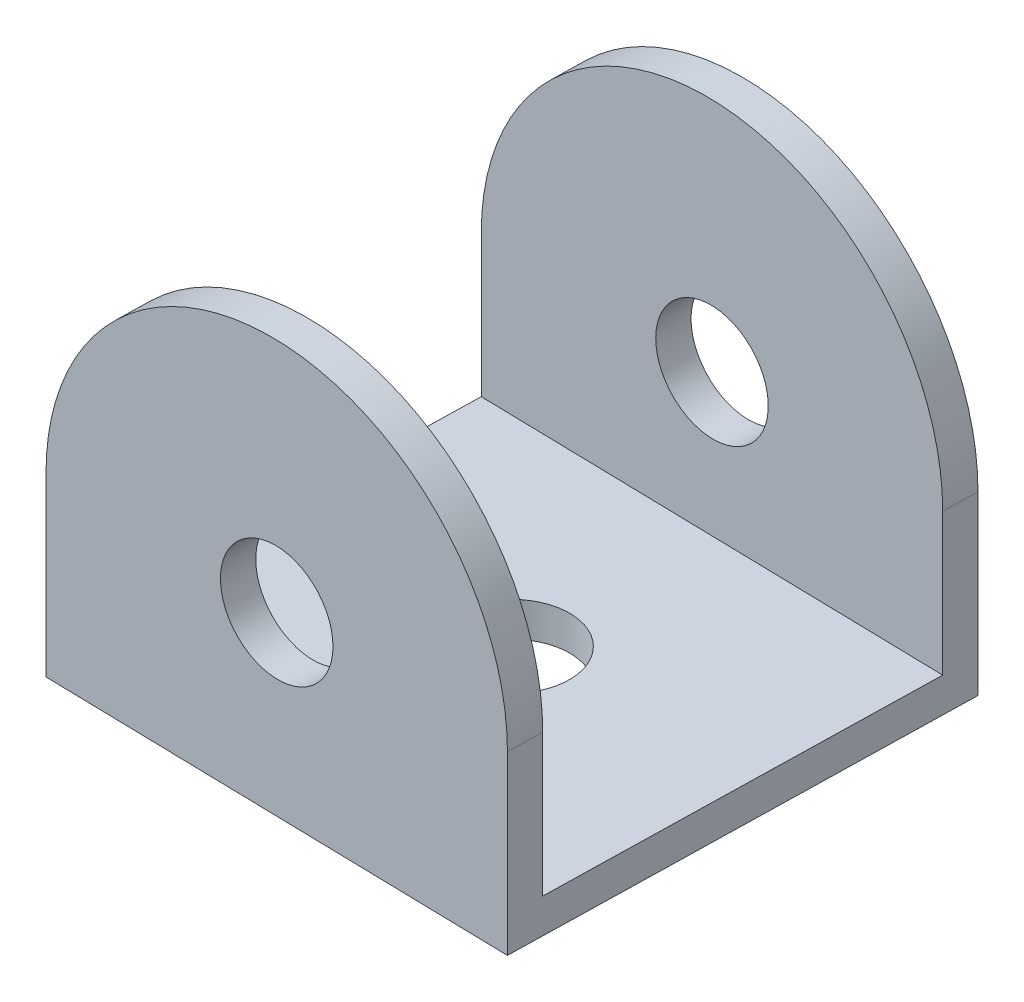
ISO-10303-21;
HEADER;
FILE_DESCRIPTION(('STEP AP214'),'2;1');
FILE_NAME('part.step','',(''),(''),'','','');
FILE_SCHEMA(('AUTOMOTIVE_DESIGN { 1 0 10303 214 1 1 1 1 }'));
ENDSEC;
DATA;
#1=APPLICATION_CONTEXT('core data for automotive mechanical design processes');
#2=APPLICATION_PROTOCOL_DEFINITION('international standard','automotive_design',2000,#1);
#3=PRODUCT_CONTEXT('',#1,'mechanical');
#4=PRODUCT('Part','Part','',(#3));
#5=PRODUCT_RELATED_PRODUCT_CATEGORY('part','',(#4));
#6=PRODUCT_DEFINITION_FORMATION('','',#4);
#7=PRODUCT_DEFINITION_CONTEXT('part definition',#1,'design');
#8=PRODUCT_DEFINITION('design','',#6,#7);
#9=PRODUCT_DEFINITION_SHAPE('','',#8);
#10=(LENGTH_UNIT() NAMED_UNIT(*) SI_UNIT(.MILLI.,.METRE.));
#11=(NAMED_UNIT(*) PLANE_ANGLE_UNIT() SI_UNIT($,.RADIAN.));
#12=(NAMED_UNIT(*) SI_UNIT($,.STERADIAN.) SOLID_ANGLE_UNIT());
#13=UNCERTAINTY_MEASURE_WITH_UNIT(LENGTH_MEASURE(1.E-05),#10,'distance_accuracy_value','');
#14=(GEOMETRIC_REPRESENTATION_CONTEXT(3) GLOBAL_UNCERTAINTY_ASSIGNED_CONTEXT((#13)) GLOBAL_UNIT_ASSIGNED_CONTEXT((#10,
#11,#12)) REPRESENTATION_CONTEXT('',''));
#15=CARTESIAN_POINT('',(0.,0.,0.));
#16=DIRECTION('',(0.,0.,1.));
#17=DIRECTION('',(1.,0.,0.));
#18=AXIS2_PLACEMENT_3D('',#15,#16,#17);
#19=CARTESIAN_POINT('',(0.,3.,0.));
#20=DIRECTION('',(0.,1.,0.));
#21=DIRECTION('',(0.,0.,1.));
#22=AXIS2_PLACEMENT_3D('',#19,#20,#21);
#23=PLANE('',#22);
#24=CARTESIAN_POINT('',(20.9379350494303,3.,-19.5410561604494));
#25=DIRECTION('',(0.,1.,0.));
#26=DIRECTION('',(0.,0.,1.));
#27=AXIS2_PLACEMENT_3D('',#24,#25,#26);
#28=CIRCLE('',#27,5.);
#29=CARTESIAN_POINT('',(20.9379350494303,3.,-14.5410561604494));
#30=VERTEX_POINT('',#29);
#31=EDGE_CURVE('E154',#30,#30,#28,.T.);
#32=ORIENTED_EDGE('',*,*,#31,.F.);
#33=EDGE_LOOP('',(#32));
#34=FACE_BOUND('',#33,.T.);
#35=DIRECTION('',(0.0221481861620144,0.,-0.999754698838537));
#36=VECTOR('',#35,1.);
#37=CARTESIAN_POINT('',(40.98994265238,3.,0.908075632642602));
#38=LINE('',#37,#36);
#39=CARTESIAN_POINT('',(41.0563872108661,3.,-2.09118846387301));
#40=VERTEX_POINT('',#39);
#41=CARTESIAN_POINT('',(41.8094255403745,3.,-36.0828482243833));
#42=VERTEX_POINT('',#41);
#43=EDGE_CURVE('E55',#40,#42,#38,.T.);
#44=ORIENTED_EDGE('',*,*,#43,.T.);
#45=DIRECTION('',(-0.999754698838536,0.,-0.0221481861620145));
#46=VECTOR('',#45,1.);
#47=CARTESIAN_POINT('',(0.819482887994537,3.,-36.9909238570259));
#48=LINE('',#47,#46);
#49=CARTESIAN_POINT('',(0.819482887994537,3.,-36.9909238570259));
#50=VERTEX_POINT('',#49);
#51=EDGE_CURVE('E50',#42,#50,#48,.T.);
#52=ORIENTED_EDGE('',*,*,#51,.T.);
#53=DIRECTION('',(-0.0221481861620145,0.,0.999754698838536));
#54=VECTOR('',#53,1.);
#55=CARTESIAN_POINT('',(0.,3.,0.));
#56=LINE('',#55,#54);
#57=CARTESIAN_POINT('',(0.0664445584860441,3.,-2.99926409651561));
#58=VERTEX_POINT('',#57);
#59=EDGE_CURVE('E121',#50,#58,#56,.T.);
#60=ORIENTED_EDGE('',*,*,#59,.T.);
#61=DIRECTION('',(-0.999754698838537,0.,-0.0221481861620147));
#62=VECTOR('',#61,1.);
#63=CARTESIAN_POINT('',(0.0664445584860441,3.,-2.99926409651561));
#64=LINE('',#63,#62);
#65=EDGE_CURVE('E143',#40,#58,#64,.T.);
#66=ORIENTED_EDGE('',*,*,#65,.F.);
#67=EDGE_LOOP('',(#44,#52,#60,#66));
#68=FACE_BOUND('',#67,.T.);
#69=ADVANCED_FACE('F35',(#34,#68),#23,.T.);
#70=CARTESIAN_POINT('',(0.,3.,0.));
#71=DIRECTION('',(0.999754698838536,0.,0.0221481861620145));
#72=DIRECTION('',(0.0221481861620145,0.,-0.999754698838537));
#73=AXIS2_PLACEMENT_3D('',#70,#71,#72);
#74=PLANE('',#73);
#75=DIRECTION('',(-0.0221481861620145,0.,0.999754698838536));
#76=VECTOR('',#75,1.);
#77=CARTESIAN_POINT('',(0.,0.,0.));
#78=LINE('',#77,#76);
#79=CARTESIAN_POINT('',(0.88592744648058,0.,-39.9901879535415));
#80=VERTEX_POINT('',#79);
#81=CARTESIAN_POINT('',(0.,0.,0.));
#82=VERTEX_POINT('',#81);
#83=EDGE_CURVE('E160',#80,#82,#78,.T.);
#84=ORIENTED_EDGE('',*,*,#83,.T.);
#85=DIRECTION('',(0.,-1.,0.));
#86=VECTOR('',#85,1.);
#87=CARTESIAN_POINT('',(0.,3.,0.));
#88=LINE('',#87,#86);
#89=CARTESIAN_POINT('',(0.,15.3240509284892,0.));
#90=VERTEX_POINT('',#89);
#91=EDGE_CURVE('E11',#90,#82,#88,.T.);
#92=ORIENTED_EDGE('',*,*,#91,.F.);
#93=DIRECTION('',(-0.0221481861620147,0.,0.999754698838536));
#94=VECTOR('',#93,1.);
#95=CARTESIAN_POINT('',(0.0664445584860441,15.3240509284892,-2.99926409651561));
#96=LINE('',#95,#94);
#97=CARTESIAN_POINT('',(0.0664445584860441,15.3240509284892,-2.99926409651561));
#98=VERTEX_POINT('',#97);
#99=EDGE_CURVE('E151',#98,#90,#96,.T.);
#100=ORIENTED_EDGE('',*,*,#99,.F.);
#101=DIRECTION('',(0.,1.,0.));
#102=VECTOR('',#101,1.);
#103=CARTESIAN_POINT('',(0.0664445584860441,0.,-2.99926409651561));
#104=LINE('',#103,#102);
#105=EDGE_CURVE('E141',#58,#98,#104,.T.);
#106=ORIENTED_EDGE('',*,*,#105,.F.);
#107=ORIENTED_EDGE('',*,*,#59,.F.);
#108=DIRECTION('',(0.,1.,0.));
#109=VECTOR('',#108,1.);
#110=CARTESIAN_POINT('',(0.819482887994536,15.3240509284892,-36.9909238570259));
#111=LINE('',#110,#109);
#112=CARTESIAN_POINT('',(0.819482887994533,15.3240509284892,-36.9909238570259));
#113=VERTEX_POINT('',#112);
#114=EDGE_CURVE('E116',#50,#113,#111,.T.);
#115=ORIENTED_EDGE('',*,*,#114,.T.);
#116=DIRECTION('',(0.0221481861620145,0.,-0.999754698838536));
#117=VECTOR('',#116,1.);
#118=CARTESIAN_POINT('',(0.819482887994533,15.3240509284892,-36.9909238570259));
#119=LINE('',#118,#117);
#120=CARTESIAN_POINT('',(0.885927446480576,15.3240509284892,-39.9901879535415));
#121=VERTEX_POINT('',#120);
#122=EDGE_CURVE('E99',#113,#121,#119,.T.);
#123=ORIENTED_EDGE('',*,*,#122,.T.);
#124=DIRECTION('',(0.,-1.,0.));
#125=VECTOR('',#124,1.);
#126=CARTESIAN_POINT('',(0.88592744648058,3.,-39.9901879535415));
#127=LINE('',#126,#125);
#128=EDGE_CURVE('E166',#121,#80,#127,.T.);
#129=ORIENTED_EDGE('',*,*,#128,.T.);
#130=EDGE_LOOP('',(#84,#92,#100,#106,#107,#115,#123,#129));
#131=FACE_BOUND('',#130,.T.);
#132=ADVANCED_FACE('F37',(#131),#74,.F.);
#133=CARTESIAN_POINT('',(0.,3.,0.));
#134=DIRECTION('',(0.0221481861620147,0.,-0.999754698838536));
#135=DIRECTION('',(-0.999754698838537,0.,-0.0221481861620147));
#136=AXIS2_PLACEMENT_3D('',#133,#134,#135);
#137=PLANE('',#136);
#138=DIRECTION('',(0.999754698838536,0.,0.0221481861620147));
#139=VECTOR('',#138,1.);
#140=CARTESIAN_POINT('',(0.,0.,0.));
#141=LINE('',#140,#139);
#142=CARTESIAN_POINT('',(40.98994265238,0.,0.908075632642602));
#143=VERTEX_POINT('',#142);
#144=EDGE_CURVE('E168',#82,#143,#141,.T.);
#145=ORIENTED_EDGE('',*,*,#144,.T.);
#146=DIRECTION('',(0.,-1.,0.));
#147=VECTOR('',#146,1.);
#148=CARTESIAN_POINT('',(40.98994265238,3.,0.908075632642602));
#149=LINE('',#148,#147);
#150=CARTESIAN_POINT('',(40.98994265238,15.3240509284892,0.908075632642603));
#151=VERTEX_POINT('',#150);
#152=EDGE_CURVE('E43',#151,#143,#149,.T.);
#153=ORIENTED_EDGE('',*,*,#152,.F.);
#154=CARTESIAN_POINT('',(20.49497132619,15.3240509284892,0.454037816321301));
#155=DIRECTION('',(-0.0221481861620147,0.,0.999754698838536));
#156=DIRECTION('',(0.999754698838537,0.,0.0221481861620147));
#157=AXIS2_PLACEMENT_3D('',#154,#155,#156);
#158=CIRCLE('',#157,20.5);
#159=EDGE_CURVE('E135',#151,#90,#158,.T.);
#160=ORIENTED_EDGE('',*,*,#159,.T.);
#161=ORIENTED_EDGE('',*,*,#91,.T.);
#162=EDGE_LOOP('',(#145,#153,#160,#161));
#163=FACE_BOUND('',#162,.T.);
#164=CARTESIAN_POINT('',(20.49497132619,15.3240509284892,0.454037816321301));
#165=DIRECTION('',(-0.0221481861620147,0.,0.999754698838536));
#166=DIRECTION('',(0.999754698838537,0.,0.0221481861620147));
#167=AXIS2_PLACEMENT_3D('',#164,#165,#166);
#168=CIRCLE('',#167,5.);
#169=CARTESIAN_POINT('',(25.4937448203827,15.3240509284892,0.564778747131375));
#170=VERTEX_POINT('',#169);
#171=EDGE_CURVE('E129',#170,#170,#168,.T.);
#172=ORIENTED_EDGE('',*,*,#171,.F.);
#173=EDGE_LOOP('',(#172));
#174=FACE_BOUND('',#173,.T.);
#175=ADVANCED_FACE('F194',(#163,#174),#137,.F.);
#176=CARTESIAN_POINT('',(40.98994265238,3.,0.908075632642602));
#177=DIRECTION('',(-0.999754698838536,0.,-0.0221481861620144));
#178=DIRECTION('',(-0.0221481861620144,0.,0.999754698838537));
#179=AXIS2_PLACEMENT_3D('',#176,#177,#178);
#180=PLANE('',#179);
#181=DIRECTION('',(0.0221481861620144,0.,-0.999754698838537));
#182=VECTOR('',#181,1.);
#183=CARTESIAN_POINT('',(40.98994265238,0.,0.908075632642602));
#184=LINE('',#183,#182);
#185=CARTESIAN_POINT('',(41.8758700988606,0.,-39.0821123208989));
#186=VERTEX_POINT('',#185);
#187=EDGE_CURVE('E170',#143,#186,#184,.T.);
#188=ORIENTED_EDGE('',*,*,#187,.T.);
#189=DIRECTION('',(0.,-1.,0.));
#190=VECTOR('',#189,1.);
#191=CARTESIAN_POINT('',(41.8758700988606,3.,-39.0821123208989));
#192=LINE('',#191,#190);
#193=CARTESIAN_POINT('',(41.8758700988606,15.3240509284892,-39.0821123208989));
#194=VERTEX_POINT('',#193);
#195=EDGE_CURVE('E174',#194,#186,#192,.T.);
#196=ORIENTED_EDGE('',*,*,#195,.F.);
#197=DIRECTION('',(0.0221481861620145,0.,-0.999754698838536));
#198=VECTOR('',#197,1.);
#199=CARTESIAN_POINT('',(41.8094255403745,15.3240509284892,-36.0828482243833));
#200=LINE('',#199,#198);
#201=CARTESIAN_POINT('',(41.8094255403745,15.3240509284892,-36.0828482243833));
#202=VERTEX_POINT('',#201);
#203=EDGE_CURVE('E110',#202,#194,#200,.T.);
#204=ORIENTED_EDGE('',*,*,#203,.F.);
#205=DIRECTION('',(0.,-1.,0.));
#206=VECTOR('',#205,1.);
#207=CARTESIAN_POINT('',(41.8094255403745,3.,-36.0828482243833));
#208=LINE('',#207,#206);
#209=EDGE_CURVE('E111',#202,#42,#208,.T.);
#210=ORIENTED_EDGE('',*,*,#209,.T.);
#211=ORIENTED_EDGE('',*,*,#43,.F.);
#212=DIRECTION('',(0.,-1.,0.));
#213=VECTOR('',#212,1.);
#214=CARTESIAN_POINT('',(41.056387210866,0.,-2.09118846387301));
#215=LINE('',#214,#213);
#216=CARTESIAN_POINT('',(41.056387210866,15.3240509284892,-2.09118846387301));
#217=VERTEX_POINT('',#216);
#218=EDGE_CURVE('E134',#217,#40,#215,.T.);
#219=ORIENTED_EDGE('',*,*,#218,.F.);
#220=DIRECTION('',(-0.0221481861620147,0.,0.999754698838536));
#221=VECTOR('',#220,1.);
#222=CARTESIAN_POINT('',(41.056387210866,15.3240509284892,-2.09118846387301));
#223=LINE('',#222,#221);
#224=EDGE_CURVE('E146',#217,#151,#223,.T.);
#225=ORIENTED_EDGE('',*,*,#224,.T.);
#226=ORIENTED_EDGE('',*,*,#152,.T.);
#227=EDGE_LOOP('',(#188,#196,#204,#210,#211,#219,#225,#226));
#228=FACE_BOUND('',#227,.T.);
#229=ADVANCED_FACE('F179',(#228),#180,.F.);
#230=CARTESIAN_POINT('',(41.8758700988606,3.,-39.0821123208989));
#231=DIRECTION('',(-0.0221481861620144,0.,0.999754698838536));
#232=DIRECTION('',(0.999754698838537,0.,0.0221481861620145));
#233=AXIS2_PLACEMENT_3D('',#230,#231,#232);
#234=PLANE('',#233);
#235=DIRECTION('',(-0.999754698838537,0.,-0.0221481861620144));
#236=VECTOR('',#235,1.);
#237=CARTESIAN_POINT('',(41.8758700988606,0.,-39.0821123208989));
#238=LINE('',#237,#236);
#239=EDGE_CURVE('E164',#186,#80,#238,.T.);
#240=ORIENTED_EDGE('',*,*,#239,.T.);
#241=ORIENTED_EDGE('',*,*,#128,.F.);
#242=CARTESIAN_POINT('',(21.3808987726706,15.3240509284892,-39.5361501372202));
#243=DIRECTION('',(0.0221481861620145,0.,-0.999754698838536));
#244=DIRECTION('',(-0.999754698838537,0.,-0.0221481861620145));
#245=AXIS2_PLACEMENT_3D('',#242,#243,#244);
#246=CIRCLE('',#245,20.5);
#247=EDGE_CURVE('E106',#121,#194,#246,.T.);
#248=ORIENTED_EDGE('',*,*,#247,.T.);
#249=ORIENTED_EDGE('',*,*,#195,.T.);
#250=EDGE_LOOP('',(#240,#241,#248,#249));
#251=FACE_BOUND('',#250,.T.);
#252=CARTESIAN_POINT('',(21.3808987726706,15.3240509284892,-39.5361501372202));
#253=DIRECTION('',(0.0221481861620145,0.,-0.999754698838536));
#254=DIRECTION('',(-0.999754698838537,0.,-0.0221481861620145));
#255=AXIS2_PLACEMENT_3D('',#252,#253,#254);
#256=CIRCLE('',#255,5.00000000000001);
#257=CARTESIAN_POINT('',(16.3821252784779,15.3240509284892,-39.6468910680302));
#258=VERTEX_POINT('',#257);
#259=EDGE_CURVE('E328',#258,#258,#256,.T.);
#260=ORIENTED_EDGE('',*,*,#259,.F.);
#261=EDGE_LOOP('',(#260));
#262=FACE_BOUND('',#261,.T.);
#263=ADVANCED_FACE('F188',(#251,#262),#234,.F.);
#264=CARTESIAN_POINT('',(0.,0.,0.));
#265=DIRECTION('',(0.,1.,0.));
#266=DIRECTION('',(0.,0.,1.));
#267=AXIS2_PLACEMENT_3D('',#264,#265,#266);
#268=PLANE('',#267);
#269=CARTESIAN_POINT('',(20.9379350494303,0.,-19.5410561604494));
#270=DIRECTION('',(0.,1.,0.));
#271=DIRECTION('',(0.,0.,1.));
#272=AXIS2_PLACEMENT_3D('',#269,#270,#271);
#273=CIRCLE('',#272,5.);
#274=CARTESIAN_POINT('',(20.9379350494303,0.,-14.5410561604494));
#275=VERTEX_POINT('',#274);
#276=EDGE_CURVE('E157',#275,#275,#273,.T.);
#277=ORIENTED_EDGE('',*,*,#276,.T.);
#278=EDGE_LOOP('',(#277));
#279=FACE_BOUND('',#278,.T.);
#280=ORIENTED_EDGE('',*,*,#83,.F.);
#281=ORIENTED_EDGE('',*,*,#239,.F.);
#282=ORIENTED_EDGE('',*,*,#187,.F.);
#283=ORIENTED_EDGE('',*,*,#144,.F.);
#284=EDGE_LOOP('',(#280,#281,#282,#283));
#285=FACE_BOUND('',#284,.T.);
#286=ADVANCED_FACE('F186',(#279,#285),#268,.F.);
#287=CARTESIAN_POINT('',(20.9379350494303,0.,-19.5410561604494));
#288=DIRECTION('',(0.,1.,0.));
#289=DIRECTION('',(0.,0.,1.));
#290=AXIS2_PLACEMENT_3D('',#287,#288,#289);
#291=CYLINDRICAL_SURFACE('',#290,5.);
#292=ORIENTED_EDGE('',*,*,#276,.F.);
#293=EDGE_LOOP('',(#292));
#294=FACE_BOUND('',#293,.T.);
#295=ORIENTED_EDGE('',*,*,#31,.T.);
#296=EDGE_LOOP('',(#295));
#297=FACE_BOUND('',#296,.T.);
#298=ADVANCED_FACE('F201',(#294,#297),#291,.F.);
#299=CARTESIAN_POINT('',(20.561415884676,15.3240509284892,-2.54522628019431));
#300=DIRECTION('',(-0.0221481861620147,0.,0.999754698838536));
#301=DIRECTION('',(0.999754698838537,0.,0.0221481861620147));
#302=AXIS2_PLACEMENT_3D('',#299,#300,#301);
#303=CYLINDRICAL_SURFACE('',#302,5.);
#304=CARTESIAN_POINT('',(20.561415884676,15.3240509284892,-2.54522628019431));
#305=DIRECTION('',(-0.0221481861620147,0.,0.999754698838536));
#306=DIRECTION('',(0.999754698838537,0.,0.0221481861620147));
#307=AXIS2_PLACEMENT_3D('',#304,#305,#306);
#308=CIRCLE('',#307,5.);
#309=CARTESIAN_POINT('',(25.5601893788687,15.3240509284892,-2.43448534938423));
#310=VERTEX_POINT('',#309);
#311=EDGE_CURVE('E131',#310,#310,#308,.T.);
#312=CARTESIAN_POINT('',(25.5601893788687,15.3240509284892,-2.43448534938423));
#313=CARTESIAN_POINT('',(25.5594972480512,15.3240509284892,-2.40324301504553));
#314=CARTESIAN_POINT('',(25.5588051172336,15.3240509284892,-2.37200068070683));
#315=CARTESIAN_POINT('',(25.5574208555985,15.3240509284892,-2.30951601202942));
#316=CARTESIAN_POINT('',(25.5567287247809,15.3240509284892,-2.27827367769071));
#317=CARTESIAN_POINT('',(25.5553444631458,15.3240509284892,-2.2157890090133));
#318=CARTESIAN_POINT('',(25.5546523323282,15.3240509284892,-2.1845466746746));
#319=CARTESIAN_POINT('',(25.5532680706931,15.3240509284892,-2.12206200599719));
#320=CARTESIAN_POINT('',(25.5525759398755,15.3240509284892,-2.09081967165849));
#321=CARTESIAN_POINT('',(25.5511916782404,15.3240509284892,-2.02833500298108));
#322=CARTESIAN_POINT('',(25.5504995474228,15.3240509284892,-1.99709266864237));
#323=CARTESIAN_POINT('',(25.5491152857877,15.3240509284892,-1.93460799996497));
#324=CARTESIAN_POINT('',(25.5484231549701,15.3240509284892,-1.90336566562626));
#325=CARTESIAN_POINT('',(25.547038893335,15.3240509284892,-1.84088099694885));
#326=CARTESIAN_POINT('',(25.5463467625175,15.3240509284892,-1.80963866261015));
#327=CARTESIAN_POINT('',(25.5449625008823,15.3240509284892,-1.74715399393274));
#328=CARTESIAN_POINT('',(25.5442703700648,15.3240509284892,-1.71591165959404));
#329=CARTESIAN_POINT('',(25.5428861084296,15.3240509284892,-1.65342699091663));
#330=CARTESIAN_POINT('',(25.5421939776121,15.3240509284892,-1.62218465657792));
#331=CARTESIAN_POINT('',(25.540809715977,15.3240509284892,-1.55969998790052));
#332=CARTESIAN_POINT('',(25.5401175851594,15.3240509284892,-1.52845765356181));
#333=CARTESIAN_POINT('',(25.5387333235243,15.3240509284892,-1.4659729848844));
#334=CARTESIAN_POINT('',(25.5380411927067,15.3240509284892,-1.4347306505457));
#335=CARTESIAN_POINT('',(25.5366569310716,15.3240509284892,-1.37224598186829));
#336=CARTESIAN_POINT('',(25.535964800254,15.3240509284892,-1.34100364752959));
#337=CARTESIAN_POINT('',(25.5345805386189,15.3240509284892,-1.27851897885218));
#338=CARTESIAN_POINT('',(25.5338884078013,15.3240509284892,-1.24727664451347));
#339=CARTESIAN_POINT('',(25.5325041461662,15.3240509284892,-1.18479197583606));
#340=CARTESIAN_POINT('',(25.5318120153486,15.3240509284892,-1.15354964149736));
#341=CARTESIAN_POINT('',(25.5304277537135,15.3240509284892,-1.09106497281995));
#342=CARTESIAN_POINT('',(25.5297356228959,15.3240509284892,-1.05982263848125));
#343=CARTESIAN_POINT('',(25.5283513612608,15.3240509284892,-0.997337969803839));
#344=CARTESIAN_POINT('',(25.5276592304433,15.3240509284892,-0.966095635465134));
#345=CARTESIAN_POINT('',(25.5262749688081,15.3240509284892,-0.903610966787726));
#346=CARTESIAN_POINT('',(25.5255828379906,15.3240509284892,-0.872368632449022));
#347=CARTESIAN_POINT('',(25.5241985763554,15.3240509284892,-0.809883963771613));
#348=CARTESIAN_POINT('',(25.5235064455379,15.3240509284892,-0.778641629432909));
#349=CARTESIAN_POINT('',(25.5221221839028,15.3240509284892,-0.7161569607555));
#350=CARTESIAN_POINT('',(25.5214300530852,15.3240509284892,-0.684914626416796));
#351=CARTESIAN_POINT('',(25.5200457914501,15.3240509284892,-0.622429957739387));
#352=CARTESIAN_POINT('',(25.5193536606325,15.3240509284892,-0.591187623400683));
#353=CARTESIAN_POINT('',(25.5179693989974,15.3240509284892,-0.528702954723275));
#354=CARTESIAN_POINT('',(25.5172772681798,15.3240509284892,-0.49746062038457));
#355=CARTESIAN_POINT('',(25.5158930065447,15.3240509284892,-0.434975951707162));
#356=CARTESIAN_POINT('',(25.5152008757271,15.3240509284892,-0.403733617368458));
#357=CARTESIAN_POINT('',(25.513816614092,15.3240509284892,-0.341248948691049));
#358=CARTESIAN_POINT('',(25.5131244832744,15.3240509284892,-0.310006614352345));
#359=CARTESIAN_POINT('',(25.5117402216393,15.3240509284892,-0.247521945674936));
#360=CARTESIAN_POINT('',(25.5110480908217,15.3240509284892,-0.216279611336232));
#361=CARTESIAN_POINT('',(25.5096638291866,15.3240509284892,-0.153794942658823));
#362=CARTESIAN_POINT('',(25.5089716983691,15.3240509284892,-0.122552608320119));
#363=CARTESIAN_POINT('',(25.5075874367339,15.3240509284892,-0.0600679396427106));
#364=CARTESIAN_POINT('',(25.5068953059164,15.3240509284892,-0.0288256053040065));
#365=CARTESIAN_POINT('',(25.5055110442812,15.3240509284892,0.0336590633734018));
#366=CARTESIAN_POINT('',(25.5048189134637,15.3240509284892,0.0649013977121062));
#367=CARTESIAN_POINT('',(25.5034346518286,15.3240509284892,0.127386066389515));
#368=CARTESIAN_POINT('',(25.502742521011,15.3240509284892,0.158628400728219));
#369=CARTESIAN_POINT('',(25.5013582593759,15.3240509284892,0.221113069405628));
#370=CARTESIAN_POINT('',(25.5006661285583,15.3240509284892,0.252355403744332));
#371=CARTESIAN_POINT('',(25.4992818669232,15.3240509284892,0.31484007242174));
#372=CARTESIAN_POINT('',(25.4985897361056,15.3240509284892,0.346082406760444));
#373=CARTESIAN_POINT('',(25.4972054744705,15.3240509284892,0.408567075437853));
#374=CARTESIAN_POINT('',(25.4965133436529,15.3240509284892,0.439809409776557));
#375=CARTESIAN_POINT('',(25.4951290820178,15.3240509284892,0.502294078453966));
#376=CARTESIAN_POINT('',(25.4944369512002,15.3240509284892,0.53353641279267));
#377=CARTESIAN_POINT('',(25.4937448203827,15.3240509284892,0.564778747131375));
#378=B_SPLINE_CURVE_WITH_KNOTS('',3,(#312,#313,#314,#315,#316,#317,#318,#319,#320,#321,#322,
#323,#324,#325,#326,#327,#328,#329,#330,#331,#332,#333,#334,#335,#336,#337,#338,#339,#340,#341,
#342,#343,#344,#345,#346,#347,#348,#349,#350,#351,#352,#353,#354,#355,#356,#357,#358,#359,#360,
#361,#362,#363,#364,#365,#366,#367,#368,#369,#370,#371,#372,#373,#374,#375,#376,#377),
.UNSPECIFIED.,.F.,.F.,(4,2,2,2,2,2,2,2,2,2,2,2,2,2,2,2,2,2,2,2,2,2,2,2,2,2,2,2,2,2,2,2,4),(0.,
0.0937500000000002,0.1875,0.28125,0.375,0.46875,0.5625,0.65625,0.75,0.84375,0.9375,1.03125,
1.125,1.21875,1.3125,1.40625,1.5,1.59375,1.6875,1.78125,1.875,1.96875,2.0625,2.15625,2.25,
2.34375,2.4375,2.53125,2.625,2.71875,2.8125,2.90625,3.),.UNSPECIFIED.);
#379=EDGE_CURVE('BSEAM199',#310,#170,#378,.T.);
#380=ORIENTED_EDGE('',*,*,#311,.F.);
#381=ORIENTED_EDGE('',*,*,#171,.T.);
#382=ORIENTED_EDGE('',*,*,#379,.T.);
#383=ORIENTED_EDGE('',*,*,#379,.F.);
#384=EDGE_LOOP('',(#380,#382,#381,#383));
#385=FACE_BOUND('',#384,.T.);
#386=ADVANCED_FACE('F199',(#385),#303,.F.);
#387=CARTESIAN_POINT('',(20.561415884676,15.3240509284892,-2.54522628019431));
#388=DIRECTION('',(-0.0221481861620147,0.,0.999754698838536));
#389=DIRECTION('',(0.999754698838537,0.,0.0221481861620147));
#390=AXIS2_PLACEMENT_3D('',#387,#388,#389);
#391=CYLINDRICAL_SURFACE('',#390,20.5);
#392=ORIENTED_EDGE('',*,*,#159,.F.);
#393=ORIENTED_EDGE('',*,*,#224,.F.);
#394=CARTESIAN_POINT('',(20.561415884676,15.3240509284892,-2.54522628019431));
#395=DIRECTION('',(-0.0221481861620147,0.,0.999754698838536));
#396=DIRECTION('',(0.999754698838537,0.,0.0221481861620147));
#397=AXIS2_PLACEMENT_3D('',#394,#395,#396);
#398=CIRCLE('',#397,20.5);
#399=EDGE_CURVE('E138',#217,#98,#398,.T.);
#400=ORIENTED_EDGE('',*,*,#399,.T.);
#401=ORIENTED_EDGE('',*,*,#99,.T.);
#402=EDGE_LOOP('',(#392,#393,#400,#401));
#403=FACE_BOUND('',#402,.T.);
#404=ADVANCED_FACE('F192',(#403),#391,.T.);
#405=CARTESIAN_POINT('',(0.0664445584860441,0.,-2.99926409651561));
#406=DIRECTION('',(-0.0221481861620147,0.,0.999754698838536));
#407=DIRECTION('',(0.999754698838537,0.,0.0221481861620147));
#408=AXIS2_PLACEMENT_3D('',#405,#406,#407);
#409=PLANE('',#408);
#410=ORIENTED_EDGE('',*,*,#311,.T.);
#411=EDGE_LOOP('',(#410));
#412=FACE_BOUND('',#411,.T.);
#413=ORIENTED_EDGE('',*,*,#218,.T.);
#414=ORIENTED_EDGE('',*,*,#65,.T.);
#415=ORIENTED_EDGE('',*,*,#105,.T.);
#416=ORIENTED_EDGE('',*,*,#399,.F.);
#417=EDGE_LOOP('',(#413,#414,#415,#416));
#418=FACE_BOUND('',#417,.T.);
#419=ADVANCED_FACE('F208',(#412,#418),#409,.F.);
#420=CARTESIAN_POINT('',(21.3144542141845,15.3240509284892,-36.5368860407046));
#421=DIRECTION('',(0.0221481861620145,0.,-0.999754698838536));
#422=DIRECTION('',(-0.999754698838537,0.,-0.0221481861620145));
#423=AXIS2_PLACEMENT_3D('',#420,#421,#422);
#424=CYLINDRICAL_SURFACE('',#423,20.5);
#425=ORIENTED_EDGE('',*,*,#247,.F.);
#426=ORIENTED_EDGE('',*,*,#122,.F.);
#427=CARTESIAN_POINT('',(21.3144542141845,15.3240509284892,-36.5368860407046));
#428=DIRECTION('',(0.0221481861620145,0.,-0.999754698838536));
#429=DIRECTION('',(-0.999754698838537,0.,-0.0221481861620145));
#430=AXIS2_PLACEMENT_3D('',#427,#428,#429);
#431=CIRCLE('',#430,20.5);
#432=EDGE_CURVE('E103',#113,#202,#431,.T.);
#433=ORIENTED_EDGE('',*,*,#432,.T.);
#434=ORIENTED_EDGE('',*,*,#203,.T.);
#435=EDGE_LOOP('',(#425,#426,#433,#434));
#436=FACE_BOUND('',#435,.T.);
#437=ADVANCED_FACE('F101',(#436),#424,.T.);
#438=CARTESIAN_POINT('',(21.3144542141845,15.3240509284892,-36.5368860407046));
#439=DIRECTION('',(0.0221481861620145,0.,-0.999754698838536));
#440=DIRECTION('',(-0.999754698838537,0.,-0.0221481861620145));
#441=AXIS2_PLACEMENT_3D('',#438,#439,#440);
#442=PLANE('',#441);
#443=CARTESIAN_POINT('',(21.3144542141845,15.3240509284892,-36.5368860407046));
#444=DIRECTION('',(0.0221481861620145,0.,-0.999754698838536));
#445=DIRECTION('',(-0.999754698838537,0.,-0.0221481861620145));
#446=AXIS2_PLACEMENT_3D('',#443,#444,#445);
#447=CIRCLE('',#446,5.00000000000001);
#448=CARTESIAN_POINT('',(16.3156807199918,15.3240509284892,-36.6476269715146));
#449=VERTEX_POINT('',#448);
#450=EDGE_CURVE('E128',#449,#449,#447,.T.);
#451=ORIENTED_EDGE('',*,*,#450,.T.);
#452=EDGE_LOOP('',(#451));
#453=FACE_BOUND('',#452,.T.);
#454=ORIENTED_EDGE('',*,*,#51,.F.);
#455=ORIENTED_EDGE('',*,*,#209,.F.);
#456=ORIENTED_EDGE('',*,*,#432,.F.);
#457=ORIENTED_EDGE('',*,*,#114,.F.);
#458=EDGE_LOOP('',(#454,#455,#456,#457));
#459=FACE_BOUND('',#458,.T.);
#460=ADVANCED_FACE('F115',(#453,#459),#442,.F.);
#461=CARTESIAN_POINT('',(21.3144542141845,15.3240509284892,-36.5368860407046));
#462=DIRECTION('',(0.0221481861620145,0.,-0.999754698838536));
#463=DIRECTION('',(-0.999754698838537,0.,-0.0221481861620145));
#464=AXIS2_PLACEMENT_3D('',#461,#462,#463);
#465=CYLINDRICAL_SURFACE('',#464,5.00000000000001);
#466=CARTESIAN_POINT('',(16.3156807199918,15.3240509284892,-36.6476269715146));
#467=CARTESIAN_POINT('',(16.3163728508094,15.3240509284892,-36.6788693058534));
#468=CARTESIAN_POINT('',(16.317064981627,15.3240509284892,-36.7101116401921));
#469=CARTESIAN_POINT('',(16.3184492432621,15.3240509284892,-36.7725963088695));
#470=CARTESIAN_POINT('',(16.3191413740797,15.3240509284892,-36.8038386432082));
#471=CARTESIAN_POINT('',(16.3205256357148,15.3240509284892,-36.8663233118856));
#472=CARTESIAN_POINT('',(16.3212177665323,15.3240509284892,-36.8975656462243));
#473=CARTESIAN_POINT('',(16.3226020281675,15.3240509284892,-36.9600503149017));
#474=CARTESIAN_POINT('',(16.323294158985,15.3240509284892,-36.9912926492404));
#475=CARTESIAN_POINT('',(16.3246784206202,15.3240509284892,-37.0537773179178));
#476=CARTESIAN_POINT('',(16.3253705514377,15.3240509284892,-37.0850196522565));
#477=CARTESIAN_POINT('',(16.3267548130728,15.3240509284892,-37.1475043209339));
#478=CARTESIAN_POINT('',(16.3274469438904,15.3240509284892,-37.1787466552726));
#479=CARTESIAN_POINT('',(16.3288312055255,15.3240509284892,-37.24123132395));
#480=CARTESIAN_POINT('',(16.3295233363431,15.3240509284892,-37.2724736582887));
#481=CARTESIAN_POINT('',(16.3309075979782,15.3240509284892,-37.3349583269661));
#482=CARTESIAN_POINT('',(16.3315997287958,15.3240509284892,-37.3662006613048));
#483=CARTESIAN_POINT('',(16.3329839904309,15.3240509284892,-37.4286853299823));
#484=CARTESIAN_POINT('',(16.3336761212485,15.3240509284892,-37.459927664321));
#485=CARTESIAN_POINT('',(16.3350603828836,15.3240509284892,-37.5224123329984));
#486=CARTESIAN_POINT('',(16.3357525137012,15.3240509284892,-37.5536546673371));
#487=CARTESIAN_POINT('',(16.3371367753363,15.3240509284892,-37.6161393360145));
#488=CARTESIAN_POINT('',(16.3378289061539,15.3240509284892,-37.6473816703532));
#489=CARTESIAN_POINT('',(16.339213167789,15.3240509284892,-37.7098663390306));
#490=CARTESIAN_POINT('',(16.3399052986065,15.3240509284892,-37.7411086733693));
#491=CARTESIAN_POINT('',(16.3412895602417,15.3240509284892,-37.8035933420467));
#492=CARTESIAN_POINT('',(16.3419816910592,15.3240509284892,-37.8348356763854));
#493=CARTESIAN_POINT('',(16.3433659526944,15.3240509284892,-37.8973203450628));
#494=CARTESIAN_POINT('',(16.3440580835119,15.3240509284892,-37.9285626794015));
#495=CARTESIAN_POINT('',(16.345442345147,15.3240509284892,-37.9910473480789));
#496=CARTESIAN_POINT('',(16.3461344759646,15.3240509284892,-38.0222896824176));
#497=CARTESIAN_POINT('',(16.3475187375997,15.3240509284892,-38.084774351095));
#498=CARTESIAN_POINT('',(16.3482108684173,15.3240509284892,-38.1160166854337));
#499=CARTESIAN_POINT('',(16.3495951300524,15.3240509284892,-38.1785013541112));
#500=CARTESIAN_POINT('',(16.35028726087,15.3240509284892,-38.2097436884499));
#501=CARTESIAN_POINT('',(16.3516715225051,15.3240509284892,-38.2722283571273));
#502=CARTESIAN_POINT('',(16.3523636533227,15.3240509284892,-38.303470691466));
#503=CARTESIAN_POINT('',(16.3537479149578,15.3240509284892,-38.3659553601434));
#504=CARTESIAN_POINT('',(16.3544400457754,15.3240509284892,-38.3971976944821));
#505=CARTESIAN_POINT('',(16.3558243074105,15.3240509284892,-38.4596823631595));
#506=CARTESIAN_POINT('',(16.3565164382281,15.3240509284892,-38.4909246974982));
#507=CARTESIAN_POINT('',(16.3579006998632,15.3240509284892,-38.5534093661756));
#508=CARTESIAN_POINT('',(16.3585928306807,15.3240509284892,-38.5846517005143));
#509=CARTESIAN_POINT('',(16.3599770923159,15.3240509284892,-38.6471363691917));
#510=CARTESIAN_POINT('',(16.3606692231334,15.3240509284892,-38.6783787035304));
#511=CARTESIAN_POINT('',(16.3620534847686,15.3240509284892,-38.7408633722078));
#512=CARTESIAN_POINT('',(16.3627456155861,15.3240509284892,-38.7721057065465));
#513=CARTESIAN_POINT('',(16.3641298772212,15.3240509284892,-38.8345903752239));
#514=CARTESIAN_POINT('',(16.3648220080388,15.3240509284892,-38.8658327095626));
#515=CARTESIAN_POINT('',(16.3662062696739,15.3240509284892,-38.9283173782401));
#516=CARTESIAN_POINT('',(16.3668984004915,15.3240509284892,-38.9595597125788));
#517=CARTESIAN_POINT('',(16.3682826621266,15.3240509284892,-39.0220443812562));
#518=CARTESIAN_POINT('',(16.3689747929442,15.3240509284892,-39.0532867155949));
#519=CARTESIAN_POINT('',(16.3703590545793,15.3240509284892,-39.1157713842723));
#520=CARTESIAN_POINT('',(16.3710511853969,15.3240509284892,-39.147013718611));
#521=CARTESIAN_POINT('',(16.372435447032,15.3240509284892,-39.2094983872884));
#522=CARTESIAN_POINT('',(16.3731275778496,15.3240509284892,-39.2407407216271));
#523=CARTESIAN_POINT('',(16.3745118394847,15.3240509284892,-39.3032253903045));
#524=CARTESIAN_POINT('',(16.3752039703023,15.3240509284892,-39.3344677246432));
#525=CARTESIAN_POINT('',(16.3765882319374,15.3240509284892,-39.3969523933206));
#526=CARTESIAN_POINT('',(16.3772803627549,15.3240509284892,-39.4281947276593));
#527=CARTESIAN_POINT('',(16.3786646243901,15.3240509284892,-39.4906793963367));
#528=CARTESIAN_POINT('',(16.3793567552076,15.3240509284892,-39.5219217306754));
#529=CARTESIAN_POINT('',(16.3807410168428,15.3240509284892,-39.5844063993528));
#530=CARTESIAN_POINT('',(16.3814331476603,15.3240509284892,-39.6156487336916));
#531=CARTESIAN_POINT('',(16.3821252784779,15.3240509284892,-39.6468910680302));
#532=B_SPLINE_CURVE_WITH_KNOTS('',3,(#466,#467,#468,#469,#470,#471,#472,#473,#474,#475,#476,
#477,#478,#479,#480,#481,#482,#483,#484,#485,#486,#487,#488,#489,#490,#491,#492,#493,#494,#495,
#496,#497,#498,#499,#500,#501,#502,#503,#504,#505,#506,#507,#508,#509,#510,#511,#512,#513,#514,
#515,#516,#517,#518,#519,#520,#521,#522,#523,#524,#525,#526,#527,#528,#529,#530,#531),
.UNSPECIFIED.,.F.,.F.,(4,2,2,2,2,2,2,2,2,2,2,2,2,2,2,2,2,2,2,2,2,2,2,2,2,2,2,2,2,2,2,2,4),(0.,
0.0937499999999972,0.187499999999994,0.281249999999998,0.374999999999996,0.46875,
0.562499999999997,0.656249999999994,0.749999999999998,0.843749999999995,0.9375,1.03125,
1.12499999999999,1.21875,1.3125,1.40625,1.5,1.59374999999999,1.6875,1.78125,1.875,1.96875,
2.06249999999999,2.15625,2.25,2.34375,2.4375,2.53124999999999,2.625,2.71874999999999,2.8125,
2.90625,2.99999999999999),.UNSPECIFIED.);
#533=EDGE_CURVE('BSEAM309',#449,#258,#532,.T.);
#534=ORIENTED_EDGE('',*,*,#450,.F.);
#535=ORIENTED_EDGE('',*,*,#259,.T.);
#536=ORIENTED_EDGE('',*,*,#533,.T.);
#537=ORIENTED_EDGE('',*,*,#533,.F.);
#538=EDGE_LOOP('',(#534,#536,#535,#537));
#539=FACE_BOUND('',#538,.T.);
#540=ADVANCED_FACE('F309',(#539),#465,.F.);
#541=CLOSED_SHELL('',(#69,#132,#175,#229,#263,#286,#298,#386,#404,#419,#437,#460,#540));
#542=MANIFOLD_SOLID_BREP('B2',#541);
#543=ADVANCED_BREP_SHAPE_REPRESENTATION('',(#18,#542),#14);
#544=SHAPE_DEFINITION_REPRESENTATION(#9,#543);
ENDSEC;
END-ISO-10303-21;
